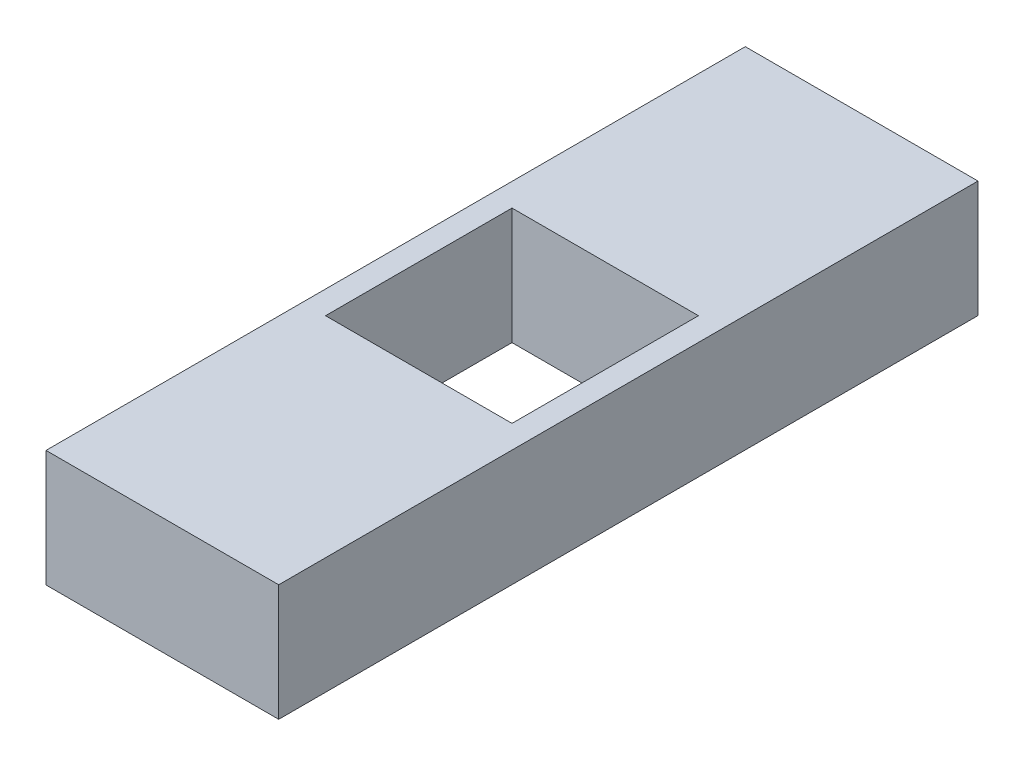
ISO-10303-21;
HEADER;
FILE_DESCRIPTION(('STEP AP214'),'2;1');
FILE_NAME('part.step','',(''),(''),'','','');
FILE_SCHEMA(('AUTOMOTIVE_DESIGN { 1 0 10303 214 1 1 1 1 }'));
ENDSEC;
DATA;
#1=APPLICATION_CONTEXT('core data for automotive mechanical design processes');
#2=APPLICATION_PROTOCOL_DEFINITION('international standard','automotive_design',2000,#1);
#3=PRODUCT_CONTEXT('',#1,'mechanical');
#4=PRODUCT('Part','Part','',(#3));
#5=PRODUCT_RELATED_PRODUCT_CATEGORY('part','',(#4));
#6=PRODUCT_DEFINITION_FORMATION('','',#4);
#7=PRODUCT_DEFINITION_CONTEXT('part definition',#1,'design');
#8=PRODUCT_DEFINITION('design','',#6,#7);
#9=PRODUCT_DEFINITION_SHAPE('','',#8);
#10=(LENGTH_UNIT() NAMED_UNIT(*) SI_UNIT(.MILLI.,.METRE.));
#11=(NAMED_UNIT(*) PLANE_ANGLE_UNIT() SI_UNIT($,.RADIAN.));
#12=(NAMED_UNIT(*) SI_UNIT($,.STERADIAN.) SOLID_ANGLE_UNIT());
#13=UNCERTAINTY_MEASURE_WITH_UNIT(LENGTH_MEASURE(1.E-05),#10,'distance_accuracy_value','');
#14=(GEOMETRIC_REPRESENTATION_CONTEXT(3) GLOBAL_UNCERTAINTY_ASSIGNED_CONTEXT((#13)) GLOBAL_UNIT_ASSIGNED_CONTEXT((#10,
#11,#12)) REPRESENTATION_CONTEXT('',''));
#15=CARTESIAN_POINT('',(0.,0.,0.));
#16=DIRECTION('',(0.,0.,1.));
#17=DIRECTION('',(1.,0.,0.));
#18=AXIS2_PLACEMENT_3D('',#15,#16,#17);
#19=CARTESIAN_POINT('',(38.03777,-19.05,228.6));
#20=DIRECTION('',(-1.,0.,0.));
#21=DIRECTION('',(0.,0.,1.));
#22=AXIS2_PLACEMENT_3D('',#19,#20,#21);
#23=PLANE('',#22);
#24=DIRECTION('',(0.,1.,0.));
#25=VECTOR('',#24,1.);
#26=CARTESIAN_POINT('',(38.03777,-19.05,0.));
#27=LINE('',#26,#25);
#28=CARTESIAN_POINT('',(38.03777,-19.05,0.));
#29=VERTEX_POINT('',#28);
#30=CARTESIAN_POINT('',(38.03777,19.05,0.));
#31=VERTEX_POINT('',#30);
#32=EDGE_CURVE('E138',#29,#31,#27,.T.);
#33=ORIENTED_EDGE('',*,*,#32,.T.);
#34=DIRECTION('',(0.,0.,-1.));
#35=VECTOR('',#34,1.);
#36=CARTESIAN_POINT('',(38.03777,19.05,228.6));
#37=LINE('',#36,#35);
#38=CARTESIAN_POINT('',(38.03777,19.05,228.6));
#39=VERTEX_POINT('',#38);
#40=EDGE_CURVE('E11',#39,#31,#37,.T.);
#41=ORIENTED_EDGE('',*,*,#40,.F.);
#42=DIRECTION('',(0.,1.,0.));
#43=VECTOR('',#42,1.);
#44=CARTESIAN_POINT('',(38.03777,-19.05,228.6));
#45=LINE('',#44,#43);
#46=CARTESIAN_POINT('',(38.03777,-19.05,228.6));
#47=VERTEX_POINT('',#46);
#48=EDGE_CURVE('E142',#47,#39,#45,.T.);
#49=ORIENTED_EDGE('',*,*,#48,.F.);
#50=DIRECTION('',(0.,0.,-1.));
#51=VECTOR('',#50,1.);
#52=CARTESIAN_POINT('',(38.03777,-19.05,228.6));
#53=LINE('',#52,#51);
#54=EDGE_CURVE('E152',#47,#29,#53,.T.);
#55=ORIENTED_EDGE('',*,*,#54,.T.);
#56=EDGE_LOOP('',(#33,#41,#49,#55));
#57=FACE_BOUND('',#56,.T.);
#58=ADVANCED_FACE('F41',(#57),#23,.F.);
#59=CARTESIAN_POINT('',(-38.03777,19.05,228.6));
#60=DIRECTION('',(0.,-1.,0.));
#61=DIRECTION('',(0.,0.,-1.));
#62=AXIS2_PLACEMENT_3D('',#59,#60,#61);
#63=PLANE('',#62);
#64=DIRECTION('',(1.,0.,0.));
#65=VECTOR('',#64,1.);
#66=CARTESIAN_POINT('',(-30.48,19.05,83.82));
#67=LINE('',#66,#65);
#68=CARTESIAN_POINT('',(-30.48,19.05,83.82));
#69=VERTEX_POINT('',#68);
#70=CARTESIAN_POINT('',(30.48,19.05,83.82));
#71=VERTEX_POINT('',#70);
#72=EDGE_CURVE('E113',#69,#71,#67,.T.);
#73=ORIENTED_EDGE('',*,*,#72,.T.);
#74=DIRECTION('',(0.,0.,1.));
#75=VECTOR('',#74,1.);
#76=CARTESIAN_POINT('',(30.48,19.05,144.78));
#77=LINE('',#76,#75);
#78=CARTESIAN_POINT('',(30.48,19.05,144.78));
#79=VERTEX_POINT('',#78);
#80=EDGE_CURVE('E107',#71,#79,#77,.T.);
#81=ORIENTED_EDGE('',*,*,#80,.T.);
#82=DIRECTION('',(-1.,0.,0.));
#83=VECTOR('',#82,1.);
#84=CARTESIAN_POINT('',(-30.48,19.05,144.78));
#85=LINE('',#84,#83);
#86=CARTESIAN_POINT('',(-30.48,19.05,144.78));
#87=VERTEX_POINT('',#86);
#88=EDGE_CURVE('E116',#79,#87,#85,.T.);
#89=ORIENTED_EDGE('',*,*,#88,.T.);
#90=DIRECTION('',(0.,0.,-1.));
#91=VECTOR('',#90,1.);
#92=CARTESIAN_POINT('',(-30.48,19.05,144.78));
#93=LINE('',#92,#91);
#94=EDGE_CURVE('E55',#87,#69,#93,.T.);
#95=ORIENTED_EDGE('',*,*,#94,.T.);
#96=EDGE_LOOP('',(#73,#81,#89,#95));
#97=FACE_BOUND('',#96,.T.);
#98=DIRECTION('',(-1.,0.,0.));
#99=VECTOR('',#98,1.);
#100=CARTESIAN_POINT('',(-38.03777,19.05,0.));
#101=LINE('',#100,#99);
#102=CARTESIAN_POINT('',(-38.03777,19.05,0.));
#103=VERTEX_POINT('',#102);
#104=EDGE_CURVE('E155',#31,#103,#101,.T.);
#105=ORIENTED_EDGE('',*,*,#104,.T.);
#106=DIRECTION('',(0.,0.,-1.));
#107=VECTOR('',#106,1.);
#108=CARTESIAN_POINT('',(-38.03777,19.05,228.6));
#109=LINE('',#108,#107);
#110=CARTESIAN_POINT('',(-38.03777,19.05,228.6));
#111=VERTEX_POINT('',#110);
#112=EDGE_CURVE('E48',#111,#103,#109,.T.);
#113=ORIENTED_EDGE('',*,*,#112,.F.);
#114=DIRECTION('',(-1.,0.,0.));
#115=VECTOR('',#114,1.);
#116=CARTESIAN_POINT('',(-38.03777,19.05,228.6));
#117=LINE('',#116,#115);
#118=EDGE_CURVE('E145',#39,#111,#117,.T.);
#119=ORIENTED_EDGE('',*,*,#118,.F.);
#120=ORIENTED_EDGE('',*,*,#40,.T.);
#121=EDGE_LOOP('',(#105,#113,#119,#120));
#122=FACE_BOUND('',#121,.T.);
#123=ADVANCED_FACE('F120',(#97,#122),#63,.F.);
#124=CARTESIAN_POINT('',(-38.03777,-19.05,228.6));
#125=DIRECTION('',(1.,0.,0.));
#126=DIRECTION('',(0.,0.,-1.));
#127=AXIS2_PLACEMENT_3D('',#124,#125,#126);
#128=PLANE('',#127);
#129=DIRECTION('',(0.,-1.,0.));
#130=VECTOR('',#129,1.);
#131=CARTESIAN_POINT('',(-38.03777,-19.05,0.));
#132=LINE('',#131,#130);
#133=CARTESIAN_POINT('',(-38.03777,-19.05,0.));
#134=VERTEX_POINT('',#133);
#135=EDGE_CURVE('E157',#103,#134,#132,.T.);
#136=ORIENTED_EDGE('',*,*,#135,.T.);
#137=DIRECTION('',(0.,0.,-1.));
#138=VECTOR('',#137,1.);
#139=CARTESIAN_POINT('',(-38.03777,-19.05,228.6));
#140=LINE('',#139,#138);
#141=CARTESIAN_POINT('',(-38.03777,-19.05,228.6));
#142=VERTEX_POINT('',#141);
#143=EDGE_CURVE('E162',#142,#134,#140,.T.);
#144=ORIENTED_EDGE('',*,*,#143,.F.);
#145=DIRECTION('',(0.,-1.,0.));
#146=VECTOR('',#145,1.);
#147=CARTESIAN_POINT('',(-38.03777,-19.05,228.6));
#148=LINE('',#147,#146);
#149=EDGE_CURVE('E148',#111,#142,#148,.T.);
#150=ORIENTED_EDGE('',*,*,#149,.F.);
#151=ORIENTED_EDGE('',*,*,#112,.T.);
#152=EDGE_LOOP('',(#136,#144,#150,#151));
#153=FACE_BOUND('',#152,.T.);
#154=ADVANCED_FACE('F169',(#153),#128,.F.);
#155=CARTESIAN_POINT('',(-38.03777,-19.05,228.6));
#156=DIRECTION('',(0.,1.,0.));
#157=DIRECTION('',(0.,0.,1.));
#158=AXIS2_PLACEMENT_3D('',#155,#156,#157);
#159=PLANE('',#158);
#160=DIRECTION('',(-1.,0.,0.));
#161=VECTOR('',#160,1.);
#162=CARTESIAN_POINT('',(-30.48,-19.05,144.78));
#163=LINE('',#162,#161);
#164=CARTESIAN_POINT('',(30.48,-19.05,144.78));
#165=VERTEX_POINT('',#164);
#166=CARTESIAN_POINT('',(-30.48,-19.05,144.78));
#167=VERTEX_POINT('',#166);
#168=EDGE_CURVE('E132',#165,#167,#163,.T.);
#169=ORIENTED_EDGE('',*,*,#168,.F.);
#170=DIRECTION('',(0.,0.,1.));
#171=VECTOR('',#170,1.);
#172=CARTESIAN_POINT('',(30.48,-19.05,144.78));
#173=LINE('',#172,#171);
#174=CARTESIAN_POINT('',(30.48,-19.05,83.82));
#175=VERTEX_POINT('',#174);
#176=EDGE_CURVE('E63',#175,#165,#173,.T.);
#177=ORIENTED_EDGE('',*,*,#176,.F.);
#178=DIRECTION('',(1.,0.,0.));
#179=VECTOR('',#178,1.);
#180=CARTESIAN_POINT('',(-30.48,-19.05,83.82));
#181=LINE('',#180,#179);
#182=CARTESIAN_POINT('',(-30.48,-19.05,83.82));
#183=VERTEX_POINT('',#182);
#184=EDGE_CURVE('E123',#183,#175,#181,.T.);
#185=ORIENTED_EDGE('',*,*,#184,.F.);
#186=DIRECTION('',(0.,0.,-1.));
#187=VECTOR('',#186,1.);
#188=CARTESIAN_POINT('',(-30.48,-19.05,144.78));
#189=LINE('',#188,#187);
#190=EDGE_CURVE('E126',#167,#183,#189,.T.);
#191=ORIENTED_EDGE('',*,*,#190,.F.);
#192=EDGE_LOOP('',(#169,#177,#185,#191));
#193=FACE_BOUND('',#192,.T.);
#194=DIRECTION('',(1.,0.,0.));
#195=VECTOR('',#194,1.);
#196=CARTESIAN_POINT('',(-38.03777,-19.05,0.));
#197=LINE('',#196,#195);
#198=EDGE_CURVE('E146',#134,#29,#197,.T.);
#199=ORIENTED_EDGE('',*,*,#198,.T.);
#200=ORIENTED_EDGE('',*,*,#54,.F.);
#201=DIRECTION('',(1.,0.,0.));
#202=VECTOR('',#201,1.);
#203=CARTESIAN_POINT('',(-38.03777,-19.05,228.6));
#204=LINE('',#203,#202);
#205=EDGE_CURVE('E150',#142,#47,#204,.T.);
#206=ORIENTED_EDGE('',*,*,#205,.F.);
#207=ORIENTED_EDGE('',*,*,#143,.T.);
#208=EDGE_LOOP('',(#199,#200,#206,#207));
#209=FACE_BOUND('',#208,.T.);
#210=ADVANCED_FACE('F177',(#193,#209),#159,.F.);
#211=CARTESIAN_POINT('',(0.,0.,228.6));
#212=DIRECTION('',(0.,0.,-1.));
#213=DIRECTION('',(-1.,0.,0.));
#214=AXIS2_PLACEMENT_3D('',#211,#212,#213);
#215=PLANE('',#214);
#216=ORIENTED_EDGE('',*,*,#48,.T.);
#217=ORIENTED_EDGE('',*,*,#118,.T.);
#218=ORIENTED_EDGE('',*,*,#149,.T.);
#219=ORIENTED_EDGE('',*,*,#205,.T.);
#220=EDGE_LOOP('',(#216,#217,#218,#219));
#221=FACE_BOUND('',#220,.T.);
#222=ADVANCED_FACE('F183',(#221),#215,.F.);
#223=CARTESIAN_POINT('',(0.,0.,0.));
#224=DIRECTION('',(0.,0.,-1.));
#225=DIRECTION('',(-1.,0.,0.));
#226=AXIS2_PLACEMENT_3D('',#223,#224,#225);
#227=PLANE('',#226);
#228=ORIENTED_EDGE('',*,*,#32,.F.);
#229=ORIENTED_EDGE('',*,*,#198,.F.);
#230=ORIENTED_EDGE('',*,*,#135,.F.);
#231=ORIENTED_EDGE('',*,*,#104,.F.);
#232=EDGE_LOOP('',(#228,#229,#230,#231));
#233=FACE_BOUND('',#232,.T.);
#234=ADVANCED_FACE('F174',(#233),#227,.T.);
#235=CARTESIAN_POINT('',(30.48,19.05,144.78));
#236=DIRECTION('',(1.,0.,0.));
#237=DIRECTION('',(0.,0.,-1.));
#238=AXIS2_PLACEMENT_3D('',#235,#236,#237);
#239=PLANE('',#238);
#240=ORIENTED_EDGE('',*,*,#176,.T.);
#241=DIRECTION('',(0.,-1.,0.));
#242=VECTOR('',#241,1.);
#243=CARTESIAN_POINT('',(30.48,19.05,144.78));
#244=LINE('',#243,#242);
#245=EDGE_CURVE('E103',#79,#165,#244,.T.);
#246=ORIENTED_EDGE('',*,*,#245,.F.);
#247=ORIENTED_EDGE('',*,*,#80,.F.);
#248=DIRECTION('',(0.,-1.,0.));
#249=VECTOR('',#248,1.);
#250=CARTESIAN_POINT('',(30.48,19.05,83.82));
#251=LINE('',#250,#249);
#252=EDGE_CURVE('E136',#71,#175,#251,.T.);
#253=ORIENTED_EDGE('',*,*,#252,.T.);
#254=EDGE_LOOP('',(#240,#246,#247,#253));
#255=FACE_BOUND('',#254,.T.);
#256=ADVANCED_FACE('F105',(#255),#239,.F.);
#257=CARTESIAN_POINT('',(-30.48,19.05,83.82));
#258=DIRECTION('',(0.,0.,-1.));
#259=DIRECTION('',(-1.,0.,0.));
#260=AXIS2_PLACEMENT_3D('',#257,#258,#259);
#261=PLANE('',#260);
#262=ORIENTED_EDGE('',*,*,#184,.T.);
#263=ORIENTED_EDGE('',*,*,#252,.F.);
#264=ORIENTED_EDGE('',*,*,#72,.F.);
#265=DIRECTION('',(0.,-1.,0.));
#266=VECTOR('',#265,1.);
#267=CARTESIAN_POINT('',(-30.48,19.05,83.82));
#268=LINE('',#267,#266);
#269=EDGE_CURVE('E139',#69,#183,#268,.T.);
#270=ORIENTED_EDGE('',*,*,#269,.T.);
#271=EDGE_LOOP('',(#262,#263,#264,#270));
#272=FACE_BOUND('',#271,.T.);
#273=ADVANCED_FACE('F200',(#272),#261,.F.);
#274=CARTESIAN_POINT('',(-30.48,19.05,144.78));
#275=DIRECTION('',(-1.,0.,0.));
#276=DIRECTION('',(0.,0.,1.));
#277=AXIS2_PLACEMENT_3D('',#274,#275,#276);
#278=PLANE('',#277);
#279=ORIENTED_EDGE('',*,*,#190,.T.);
#280=ORIENTED_EDGE('',*,*,#269,.F.);
#281=ORIENTED_EDGE('',*,*,#94,.F.);
#282=DIRECTION('',(0.,-1.,0.));
#283=VECTOR('',#282,1.);
#284=CARTESIAN_POINT('',(-30.48,19.05,144.78));
#285=LINE('',#284,#283);
#286=EDGE_CURVE('E112',#87,#167,#285,.T.);
#287=ORIENTED_EDGE('',*,*,#286,.T.);
#288=EDGE_LOOP('',(#279,#280,#281,#287));
#289=FACE_BOUND('',#288,.T.);
#290=ADVANCED_FACE('F203',(#289),#278,.F.);
#291=CARTESIAN_POINT('',(-30.48,19.05,144.78));
#292=DIRECTION('',(0.,0.,1.));
#293=DIRECTION('',(1.,0.,0.));
#294=AXIS2_PLACEMENT_3D('',#291,#292,#293);
#295=PLANE('',#294);
#296=ORIENTED_EDGE('',*,*,#168,.T.);
#297=ORIENTED_EDGE('',*,*,#286,.F.);
#298=ORIENTED_EDGE('',*,*,#88,.F.);
#299=ORIENTED_EDGE('',*,*,#245,.T.);
#300=EDGE_LOOP('',(#296,#297,#298,#299));
#301=FACE_BOUND('',#300,.T.);
#302=ADVANCED_FACE('F117',(#301),#295,.F.);
#303=CLOSED_SHELL('',(#58,#123,#154,#210,#222,#234,#256,#273,#290,#302));
#304=MANIFOLD_SOLID_BREP('B2',#303);
#305=ADVANCED_BREP_SHAPE_REPRESENTATION('',(#18,#304),#14);
#306=SHAPE_DEFINITION_REPRESENTATION(#9,#305);
ENDSEC;
END-ISO-10303-21;
